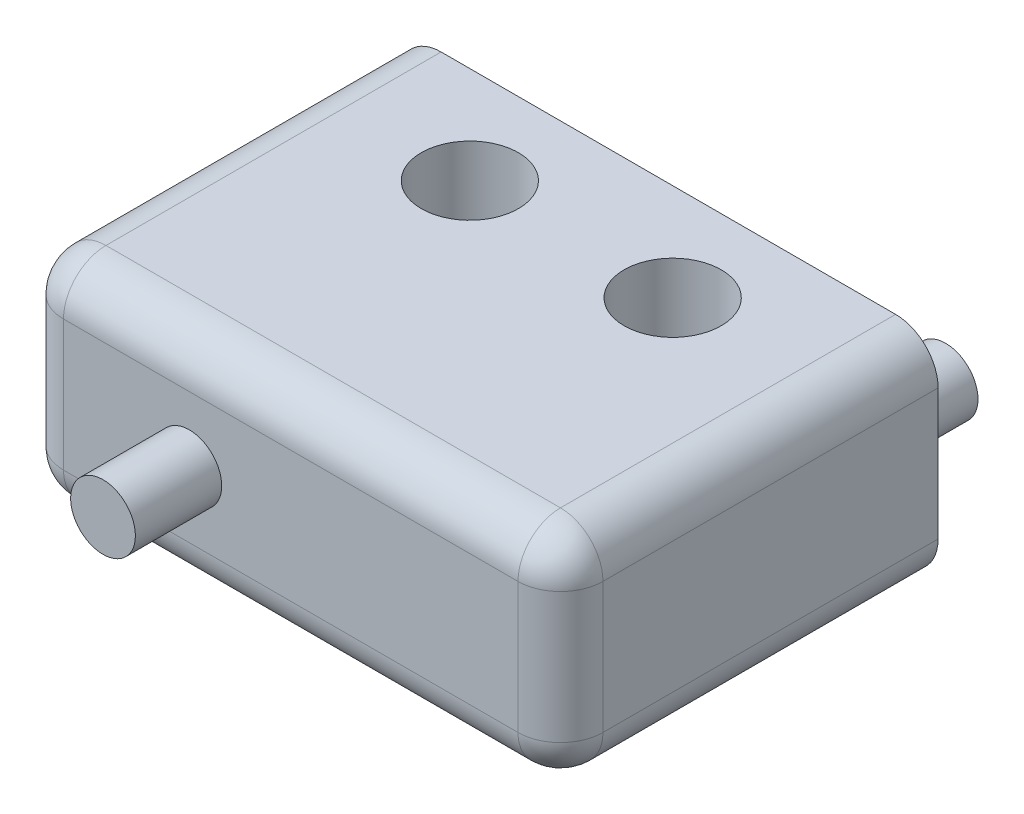
ISO-10303-21;
HEADER;
FILE_DESCRIPTION(('STEP AP214'),'2;1');
FILE_NAME('part.step','',(''),(''),'','','');
FILE_SCHEMA(('AUTOMOTIVE_DESIGN { 1 0 10303 214 1 1 1 1 }'));
ENDSEC;
DATA;
#1=APPLICATION_CONTEXT('core data for automotive mechanical design processes');
#2=APPLICATION_PROTOCOL_DEFINITION('international standard','automotive_design',2000,#1);
#3=PRODUCT_CONTEXT('',#1,'mechanical');
#4=PRODUCT('Part','Part','',(#3));
#5=PRODUCT_RELATED_PRODUCT_CATEGORY('part','',(#4));
#6=PRODUCT_DEFINITION_FORMATION('','',#4);
#7=PRODUCT_DEFINITION_CONTEXT('part definition',#1,'design');
#8=PRODUCT_DEFINITION('design','',#6,#7);
#9=PRODUCT_DEFINITION_SHAPE('','',#8);
#10=(LENGTH_UNIT() NAMED_UNIT(*) SI_UNIT(.MILLI.,.METRE.));
#11=(NAMED_UNIT(*) PLANE_ANGLE_UNIT() SI_UNIT($,.RADIAN.));
#12=(NAMED_UNIT(*) SI_UNIT($,.STERADIAN.) SOLID_ANGLE_UNIT());
#13=UNCERTAINTY_MEASURE_WITH_UNIT(LENGTH_MEASURE(1.E-05),#10,'distance_accuracy_value','');
#14=(GEOMETRIC_REPRESENTATION_CONTEXT(3) GLOBAL_UNCERTAINTY_ASSIGNED_CONTEXT((#13)) GLOBAL_UNIT_ASSIGNED_CONTEXT((#10,
#11,#12)) REPRESENTATION_CONTEXT('',''));
#15=CARTESIAN_POINT('',(0.,0.,0.));
#16=DIRECTION('',(0.,0.,1.));
#17=DIRECTION('',(1.,0.,0.));
#18=AXIS2_PLACEMENT_3D('',#15,#16,#17);
#19=CARTESIAN_POINT('',(6.35,2.54,8.89));
#20=DIRECTION('',(-1.,0.,0.));
#21=DIRECTION('',(0.,0.,1.));
#22=AXIS2_PLACEMENT_3D('',#19,#20,#21);
#23=PLANE('',#22);
#24=DIRECTION('',(0.,1.,0.));
#25=VECTOR('',#24,1.);
#26=CARTESIAN_POINT('',(6.35,2.54,0.));
#27=LINE('',#26,#25);
#28=CARTESIAN_POINT('',(6.35,-1.54,0.));
#29=VERTEX_POINT('',#28);
#30=CARTESIAN_POINT('',(6.35,1.54,0.));
#31=VERTEX_POINT('',#30);
#32=EDGE_CURVE('E212',#29,#31,#27,.T.);
#33=ORIENTED_EDGE('',*,*,#32,.T.);
#34=DIRECTION('',(0.,0.,-1.));
#35=VECTOR('',#34,1.);
#36=CARTESIAN_POINT('',(6.35,1.54,8.89));
#37=LINE('',#36,#35);
#38=CARTESIAN_POINT('',(6.35,1.54,7.89));
#39=VERTEX_POINT('',#38);
#40=EDGE_CURVE('E11',#31,#39,#37,.F.);
#41=ORIENTED_EDGE('',*,*,#40,.T.);
#42=DIRECTION('',(0.,1.,0.));
#43=VECTOR('',#42,1.);
#44=CARTESIAN_POINT('',(6.35,-2.54,7.89));
#45=LINE('',#44,#43);
#46=CARTESIAN_POINT('',(6.35,-1.54,7.89));
#47=VERTEX_POINT('',#46);
#48=EDGE_CURVE('E120',#39,#47,#45,.F.);
#49=ORIENTED_EDGE('',*,*,#48,.T.);
#50=DIRECTION('',(0.,0.,-1.));
#51=VECTOR('',#50,1.);
#52=CARTESIAN_POINT('',(6.35,-1.54,8.89));
#53=LINE('',#52,#51);
#54=EDGE_CURVE('E43',#47,#29,#53,.T.);
#55=ORIENTED_EDGE('',*,*,#54,.T.);
#56=EDGE_LOOP('',(#33,#41,#49,#55));
#57=FACE_BOUND('',#56,.T.);
#58=ADVANCED_FACE('F34',(#57),#23,.F.);
#59=CARTESIAN_POINT('',(-6.35,2.54,8.89));
#60=DIRECTION('',(0.,-1.,0.));
#61=DIRECTION('',(0.,0.,-1.));
#62=AXIS2_PLACEMENT_3D('',#59,#60,#61);
#63=PLANE('',#62);
#64=CARTESIAN_POINT('',(2.3876,2.54,2.286));
#65=DIRECTION('',(0.,1.,0.));
#66=DIRECTION('',(0.,0.,1.));
#67=AXIS2_PLACEMENT_3D('',#64,#65,#66);
#68=CIRCLE('',#67,1.143);
#69=CARTESIAN_POINT('',(2.3876,2.54,3.429));
#70=VERTEX_POINT('',#69);
#71=EDGE_CURVE('E195',#70,#70,#68,.T.);
#72=ORIENTED_EDGE('',*,*,#71,.F.);
#73=EDGE_LOOP('',(#72));
#74=FACE_BOUND('',#73,.T.);
#75=CARTESIAN_POINT('',(-2.3876,2.54,2.286));
#76=DIRECTION('',(0.,1.,0.));
#77=DIRECTION('',(0.,0.,1.));
#78=AXIS2_PLACEMENT_3D('',#75,#76,#77);
#79=CIRCLE('',#78,1.143);
#80=CARTESIAN_POINT('',(-2.3876,2.54,3.429));
#81=VERTEX_POINT('',#80);
#82=EDGE_CURVE('E187',#81,#81,#79,.T.);
#83=ORIENTED_EDGE('',*,*,#82,.F.);
#84=EDGE_LOOP('',(#83));
#85=FACE_BOUND('',#84,.T.);
#86=DIRECTION('',(-1.,0.,0.));
#87=VECTOR('',#86,1.);
#88=CARTESIAN_POINT('',(-6.35,2.54,0.));
#89=LINE('',#88,#87);
#90=CARTESIAN_POINT('',(5.35,2.54,0.));
#91=VERTEX_POINT('',#90);
#92=CARTESIAN_POINT('',(-5.35,2.54,0.));
#93=VERTEX_POINT('',#92);
#94=EDGE_CURVE('E215',#91,#93,#89,.T.);
#95=ORIENTED_EDGE('',*,*,#94,.T.);
#96=DIRECTION('',(0.,0.,-1.));
#97=VECTOR('',#96,1.);
#98=CARTESIAN_POINT('',(-5.35,2.54,8.89));
#99=LINE('',#98,#97);
#100=CARTESIAN_POINT('',(-5.35,2.54,7.89));
#101=VERTEX_POINT('',#100);
#102=EDGE_CURVE('E173',#93,#101,#99,.F.);
#103=ORIENTED_EDGE('',*,*,#102,.T.);
#104=DIRECTION('',(-1.,0.,0.));
#105=VECTOR('',#104,1.);
#106=CARTESIAN_POINT('',(6.35,2.54,7.89));
#107=LINE('',#106,#105);
#108=CARTESIAN_POINT('',(5.35,2.54,7.89));
#109=VERTEX_POINT('',#108);
#110=EDGE_CURVE('E241',#101,#109,#107,.F.);
#111=ORIENTED_EDGE('',*,*,#110,.T.);
#112=DIRECTION('',(0.,0.,-1.));
#113=VECTOR('',#112,1.);
#114=CARTESIAN_POINT('',(5.35,2.54,8.89));
#115=LINE('',#114,#113);
#116=EDGE_CURVE('E58',#109,#91,#115,.T.);
#117=ORIENTED_EDGE('',*,*,#116,.T.);
#118=EDGE_LOOP('',(#95,#103,#111,#117));
#119=FACE_BOUND('',#118,.T.);
#120=ADVANCED_FACE('F287',(#74,#85,#119),#63,.F.);
#121=CARTESIAN_POINT('',(-6.35,2.54,8.89));
#122=DIRECTION('',(1.,0.,0.));
#123=DIRECTION('',(0.,0.,-1.));
#124=AXIS2_PLACEMENT_3D('',#121,#122,#123);
#125=PLANE('',#124);
#126=DIRECTION('',(0.,-1.,0.));
#127=VECTOR('',#126,1.);
#128=CARTESIAN_POINT('',(-6.35,2.54,0.));
#129=LINE('',#128,#127);
#130=CARTESIAN_POINT('',(-6.35,1.54,0.));
#131=VERTEX_POINT('',#130);
#132=CARTESIAN_POINT('',(-6.35,-1.54,0.));
#133=VERTEX_POINT('',#132);
#134=EDGE_CURVE('E217',#131,#133,#129,.T.);
#135=ORIENTED_EDGE('',*,*,#134,.T.);
#136=DIRECTION('',(0.,0.,-1.));
#137=VECTOR('',#136,1.);
#138=CARTESIAN_POINT('',(-6.35,-1.54,8.89));
#139=LINE('',#138,#137);
#140=CARTESIAN_POINT('',(-6.35,-1.54,7.89));
#141=VERTEX_POINT('',#140);
#142=EDGE_CURVE('E170',#133,#141,#139,.F.);
#143=ORIENTED_EDGE('',*,*,#142,.T.);
#144=DIRECTION('',(0.,-1.,0.));
#145=VECTOR('',#144,1.);
#146=CARTESIAN_POINT('',(-6.35,2.54,7.89));
#147=LINE('',#146,#145);
#148=CARTESIAN_POINT('',(-6.35,1.54,7.89));
#149=VERTEX_POINT('',#148);
#150=EDGE_CURVE('E234',#141,#149,#147,.F.);
#151=ORIENTED_EDGE('',*,*,#150,.T.);
#152=DIRECTION('',(0.,0.,-1.));
#153=VECTOR('',#152,1.);
#154=CARTESIAN_POINT('',(-6.35,1.54,8.89));
#155=LINE('',#154,#153);
#156=EDGE_CURVE('E168',#149,#131,#155,.T.);
#157=ORIENTED_EDGE('',*,*,#156,.T.);
#158=EDGE_LOOP('',(#135,#143,#151,#157));
#159=FACE_BOUND('',#158,.T.);
#160=ADVANCED_FACE('F281',(#159),#125,.F.);
#161=CARTESIAN_POINT('',(-6.35,-2.54,8.89));
#162=DIRECTION('',(0.,1.,0.));
#163=DIRECTION('',(0.,0.,1.));
#164=AXIS2_PLACEMENT_3D('',#161,#162,#163);
#165=PLANE('',#164);
#166=CARTESIAN_POINT('',(2.3876,-2.54,2.286));
#167=DIRECTION('',(0.,1.,0.));
#168=DIRECTION('',(0.,0.,1.));
#169=AXIS2_PLACEMENT_3D('',#166,#167,#168);
#170=CIRCLE('',#169,1.143);
#171=CARTESIAN_POINT('',(2.3876,-2.54,3.429));
#172=VERTEX_POINT('',#171);
#173=EDGE_CURVE('E38',#172,#172,#170,.T.);
#174=ORIENTED_EDGE('',*,*,#173,.T.);
#175=EDGE_LOOP('',(#174));
#176=FACE_BOUND('',#175,.T.);
#177=CARTESIAN_POINT('',(-2.3876,-2.54,2.286));
#178=DIRECTION('',(0.,1.,0.));
#179=DIRECTION('',(0.,0.,1.));
#180=AXIS2_PLACEMENT_3D('',#177,#178,#179);
#181=CIRCLE('',#180,1.143);
#182=CARTESIAN_POINT('',(-2.3876,-2.54,3.429));
#183=VERTEX_POINT('',#182);
#184=EDGE_CURVE('E185',#183,#183,#181,.T.);
#185=ORIENTED_EDGE('',*,*,#184,.T.);
#186=EDGE_LOOP('',(#185));
#187=FACE_BOUND('',#186,.T.);
#188=DIRECTION('',(1.,0.,0.));
#189=VECTOR('',#188,1.);
#190=CARTESIAN_POINT('',(-6.35,-2.54,7.89));
#191=LINE('',#190,#189);
#192=CARTESIAN_POINT('',(5.35,-2.54,7.89));
#193=VERTEX_POINT('',#192);
#194=CARTESIAN_POINT('',(-5.35,-2.54,7.89));
#195=VERTEX_POINT('',#194);
#196=EDGE_CURVE('E237',#193,#195,#191,.F.);
#197=ORIENTED_EDGE('',*,*,#196,.T.);
#198=DIRECTION('',(0.,0.,-1.));
#199=VECTOR('',#198,1.);
#200=CARTESIAN_POINT('',(-5.35,-2.54,8.89));
#201=LINE('',#200,#199);
#202=CARTESIAN_POINT('',(-5.35,-2.54,0.));
#203=VERTEX_POINT('',#202);
#204=EDGE_CURVE('E159',#195,#203,#201,.T.);
#205=ORIENTED_EDGE('',*,*,#204,.T.);
#206=DIRECTION('',(1.,0.,0.));
#207=VECTOR('',#206,1.);
#208=CARTESIAN_POINT('',(-6.35,-2.54,0.));
#209=LINE('',#208,#207);
#210=CARTESIAN_POINT('',(5.35,-2.54,0.));
#211=VERTEX_POINT('',#210);
#212=EDGE_CURVE('E220',#203,#211,#209,.T.);
#213=ORIENTED_EDGE('',*,*,#212,.T.);
#214=DIRECTION('',(0.,0.,-1.));
#215=VECTOR('',#214,1.);
#216=CARTESIAN_POINT('',(5.35,-2.54,8.89));
#217=LINE('',#216,#215);
#218=EDGE_CURVE('E124',#211,#193,#217,.F.);
#219=ORIENTED_EDGE('',*,*,#218,.T.);
#220=EDGE_LOOP('',(#197,#205,#213,#219));
#221=FACE_BOUND('',#220,.T.);
#222=ADVANCED_FACE('F267',(#176,#187,#221),#165,.F.);
#223=CARTESIAN_POINT('',(0.,0.,8.89));
#224=DIRECTION('',(0.,0.,1.));
#225=DIRECTION('',(1.,0.,0.));
#226=AXIS2_PLACEMENT_3D('',#223,#224,#225);
#227=PLANE('',#226);
#228=DIRECTION('',(-1.,0.,0.));
#229=VECTOR('',#228,1.);
#230=CARTESIAN_POINT('',(-6.35,1.54,8.89));
#231=LINE('',#230,#229);
#232=CARTESIAN_POINT('',(5.35,1.54,8.89));
#233=VERTEX_POINT('',#232);
#234=CARTESIAN_POINT('',(-5.35,1.54,8.89));
#235=VERTEX_POINT('',#234);
#236=EDGE_CURVE('E134',#233,#235,#231,.T.);
#237=ORIENTED_EDGE('',*,*,#236,.T.);
#238=DIRECTION('',(0.,-1.,0.));
#239=VECTOR('',#238,1.);
#240=CARTESIAN_POINT('',(-5.35,-2.54,8.89));
#241=LINE('',#240,#239);
#242=CARTESIAN_POINT('',(-5.35,-1.54,8.89));
#243=VERTEX_POINT('',#242);
#244=EDGE_CURVE('E232',#235,#243,#241,.T.);
#245=ORIENTED_EDGE('',*,*,#244,.T.);
#246=DIRECTION('',(1.,0.,0.));
#247=VECTOR('',#246,1.);
#248=CARTESIAN_POINT('',(6.35,-1.54,8.89));
#249=LINE('',#248,#247);
#250=CARTESIAN_POINT('',(5.35,-1.54,8.89));
#251=VERTEX_POINT('',#250);
#252=EDGE_CURVE('E137',#243,#251,#249,.T.);
#253=ORIENTED_EDGE('',*,*,#252,.T.);
#254=DIRECTION('',(0.,1.,0.));
#255=VECTOR('',#254,1.);
#256=CARTESIAN_POINT('',(5.35,2.54,8.89));
#257=LINE('',#256,#255);
#258=EDGE_CURVE('E118',#251,#233,#257,.T.);
#259=ORIENTED_EDGE('',*,*,#258,.T.);
#260=EDGE_LOOP('',(#237,#245,#253,#259));
#261=FACE_BOUND('',#260,.T.);
#262=CARTESIAN_POINT('',(-2.3876,0.,8.89));
#263=DIRECTION('',(0.,0.,1.));
#264=DIRECTION('',(1.,0.,0.));
#265=AXIS2_PLACEMENT_3D('',#262,#263,#264);
#266=CIRCLE('',#265,0.762);
#267=CARTESIAN_POINT('',(-1.6256,0.,8.89));
#268=VERTEX_POINT('',#267);
#269=EDGE_CURVE('E179',#268,#268,#266,.T.);
#270=ORIENTED_EDGE('',*,*,#269,.F.);
#271=EDGE_LOOP('',(#270));
#272=FACE_BOUND('',#271,.T.);
#273=ADVANCED_FACE('F131',(#261,#272),#227,.T.);
#274=CARTESIAN_POINT('',(0.,0.,0.));
#275=DIRECTION('',(0.,0.,1.));
#276=DIRECTION('',(1.,0.,0.));
#277=AXIS2_PLACEMENT_3D('',#274,#275,#276);
#278=PLANE('',#277);
#279=CARTESIAN_POINT('',(-4.7498,0.,0.));
#280=DIRECTION('',(0.,0.,1.));
#281=DIRECTION('',(1.,0.,0.));
#282=AXIS2_PLACEMENT_3D('',#279,#280,#281);
#283=CIRCLE('',#282,0.761999999999999);
#284=CARTESIAN_POINT('',(-3.9878,0.,0.));
#285=VERTEX_POINT('',#284);
#286=EDGE_CURVE('E146',#285,#285,#283,.F.);
#287=ORIENTED_EDGE('',*,*,#286,.F.);
#288=EDGE_LOOP('',(#287));
#289=FACE_BOUND('',#288,.T.);
#290=CARTESIAN_POINT('',(0.,0.,0.));
#291=DIRECTION('',(0.,0.,1.));
#292=DIRECTION('',(1.,0.,0.));
#293=AXIS2_PLACEMENT_3D('',#290,#291,#292);
#294=CIRCLE('',#293,0.762);
#295=CARTESIAN_POINT('',(0.762000000000002,0.,0.));
#296=VERTEX_POINT('',#295);
#297=EDGE_CURVE('E226',#296,#296,#294,.F.);
#298=ORIENTED_EDGE('',*,*,#297,.F.);
#299=EDGE_LOOP('',(#298));
#300=FACE_BOUND('',#299,.T.);
#301=CARTESIAN_POINT('',(4.7498,0.,0.));
#302=DIRECTION('',(0.,0.,1.));
#303=DIRECTION('',(1.,0.,0.));
#304=AXIS2_PLACEMENT_3D('',#301,#302,#303);
#305=CIRCLE('',#304,0.762);
#306=CARTESIAN_POINT('',(5.5118,0.,0.));
#307=VERTEX_POINT('',#306);
#308=EDGE_CURVE('E223',#307,#307,#305,.F.);
#309=ORIENTED_EDGE('',*,*,#308,.F.);
#310=EDGE_LOOP('',(#309));
#311=FACE_BOUND('',#310,.T.);
#312=ORIENTED_EDGE('',*,*,#212,.F.);
#313=CARTESIAN_POINT('',(-5.35,-1.54,0.));
#314=DIRECTION('',(0.,0.,1.));
#315=DIRECTION('',(1.,0.,0.));
#316=AXIS2_PLACEMENT_3D('',#313,#314,#315);
#317=CIRCLE('',#316,1.);
#318=EDGE_CURVE('E166',#203,#133,#317,.F.);
#319=ORIENTED_EDGE('',*,*,#318,.T.);
#320=ORIENTED_EDGE('',*,*,#134,.F.);
#321=CARTESIAN_POINT('',(-5.35,1.54,0.));
#322=DIRECTION('',(0.,0.,1.));
#323=DIRECTION('',(1.,0.,0.));
#324=AXIS2_PLACEMENT_3D('',#321,#322,#323);
#325=CIRCLE('',#324,1.);
#326=EDGE_CURVE('E51',#131,#93,#325,.F.);
#327=ORIENTED_EDGE('',*,*,#326,.T.);
#328=ORIENTED_EDGE('',*,*,#94,.F.);
#329=CARTESIAN_POINT('',(5.35,1.54,0.));
#330=DIRECTION('',(0.,0.,1.));
#331=DIRECTION('',(1.,0.,0.));
#332=AXIS2_PLACEMENT_3D('',#329,#330,#331);
#333=CIRCLE('',#332,1.);
#334=EDGE_CURVE('E163',#91,#31,#333,.F.);
#335=ORIENTED_EDGE('',*,*,#334,.T.);
#336=ORIENTED_EDGE('',*,*,#32,.F.);
#337=CARTESIAN_POINT('',(5.35,-1.54,0.));
#338=DIRECTION('',(0.,0.,1.));
#339=DIRECTION('',(1.,0.,0.));
#340=AXIS2_PLACEMENT_3D('',#337,#338,#339);
#341=CIRCLE('',#340,1.);
#342=EDGE_CURVE('E161',#29,#211,#341,.F.);
#343=ORIENTED_EDGE('',*,*,#342,.T.);
#344=EDGE_LOOP('',(#312,#319,#320,#327,#328,#335,#336,#343));
#345=FACE_BOUND('',#344,.T.);
#346=ADVANCED_FACE('F264',(#289,#300,#311,#345),#278,.F.);
#347=CARTESIAN_POINT('',(4.7498,0.,-1.778));
#348=DIRECTION('',(0.,0.,1.));
#349=DIRECTION('',(1.,0.,0.));
#350=AXIS2_PLACEMENT_3D('',#347,#348,#349);
#351=CYLINDRICAL_SURFACE('',#350,0.762);
#352=CARTESIAN_POINT('',(4.7498,0.,-1.778));
#353=DIRECTION('',(0.,0.,-1.));
#354=DIRECTION('',(-1.,0.,0.));
#355=AXIS2_PLACEMENT_3D('',#352,#353,#354);
#356=CIRCLE('',#355,0.762);
#357=CARTESIAN_POINT('',(3.9878,0.,-1.778));
#358=VERTEX_POINT('',#357);
#359=EDGE_CURVE('E209',#358,#358,#356,.T.);
#360=ORIENTED_EDGE('',*,*,#359,.F.);
#361=EDGE_LOOP('',(#360));
#362=FACE_BOUND('',#361,.T.);
#363=ORIENTED_EDGE('',*,*,#308,.T.);
#364=EDGE_LOOP('',(#363));
#365=FACE_BOUND('',#364,.T.);
#366=ADVANCED_FACE('F440',(#362,#365),#351,.T.);
#367=CARTESIAN_POINT('',(4.7498,0.,-1.778));
#368=DIRECTION('',(0.,0.,-1.));
#369=DIRECTION('',(-1.,0.,0.));
#370=AXIS2_PLACEMENT_3D('',#367,#368,#369);
#371=PLANE('',#370);
#372=ORIENTED_EDGE('',*,*,#359,.T.);
#373=EDGE_LOOP('',(#372));
#374=FACE_BOUND('',#373,.T.);
#375=ADVANCED_FACE('F436',(#374),#371,.T.);
#376=CARTESIAN_POINT('',(0.,0.,-1.778));
#377=DIRECTION('',(0.,0.,1.));
#378=DIRECTION('',(1.,0.,0.));
#379=AXIS2_PLACEMENT_3D('',#376,#377,#378);
#380=CYLINDRICAL_SURFACE('',#379,0.762);
#381=CARTESIAN_POINT('',(0.,0.,-1.778));
#382=DIRECTION('',(0.,0.,-1.));
#383=DIRECTION('',(-1.,0.,0.));
#384=AXIS2_PLACEMENT_3D('',#381,#382,#383);
#385=CIRCLE('',#384,0.762);
#386=CARTESIAN_POINT('',(-0.761999999999998,0.,-1.778));
#387=VERTEX_POINT('',#386);
#388=EDGE_CURVE('E206',#387,#387,#385,.T.);
#389=ORIENTED_EDGE('',*,*,#388,.F.);
#390=EDGE_LOOP('',(#389));
#391=FACE_BOUND('',#390,.T.);
#392=ORIENTED_EDGE('',*,*,#297,.T.);
#393=EDGE_LOOP('',(#392));
#394=FACE_BOUND('',#393,.T.);
#395=ADVANCED_FACE('F432',(#391,#394),#380,.T.);
#396=CARTESIAN_POINT('',(0.,0.,-1.778));
#397=DIRECTION('',(0.,0.,-1.));
#398=DIRECTION('',(-1.,0.,0.));
#399=AXIS2_PLACEMENT_3D('',#396,#397,#398);
#400=PLANE('',#399);
#401=ORIENTED_EDGE('',*,*,#388,.T.);
#402=EDGE_LOOP('',(#401));
#403=FACE_BOUND('',#402,.T.);
#404=ADVANCED_FACE('F428',(#403),#400,.T.);
#405=CARTESIAN_POINT('',(-4.7498,0.,-1.778));
#406=DIRECTION('',(0.,0.,1.));
#407=DIRECTION('',(1.,0.,0.));
#408=AXIS2_PLACEMENT_3D('',#405,#406,#407);
#409=CYLINDRICAL_SURFACE('',#408,0.761999999999999);
#410=CARTESIAN_POINT('',(-4.7498,0.,-1.778));
#411=DIRECTION('',(0.,0.,-1.));
#412=DIRECTION('',(-1.,0.,0.));
#413=AXIS2_PLACEMENT_3D('',#410,#411,#412);
#414=CIRCLE('',#413,0.761999999999999);
#415=CARTESIAN_POINT('',(-5.5118,0.,-1.778));
#416=VERTEX_POINT('',#415);
#417=EDGE_CURVE('E201',#416,#416,#414,.T.);
#418=ORIENTED_EDGE('',*,*,#417,.F.);
#419=EDGE_LOOP('',(#418));
#420=FACE_BOUND('',#419,.T.);
#421=ORIENTED_EDGE('',*,*,#286,.T.);
#422=EDGE_LOOP('',(#421));
#423=FACE_BOUND('',#422,.T.);
#424=ADVANCED_FACE('F424',(#420,#423),#409,.T.);
#425=CARTESIAN_POINT('',(-4.7498,0.,-1.778));
#426=DIRECTION('',(0.,0.,-1.));
#427=DIRECTION('',(-1.,0.,0.));
#428=AXIS2_PLACEMENT_3D('',#425,#426,#427);
#429=PLANE('',#428);
#430=ORIENTED_EDGE('',*,*,#417,.T.);
#431=EDGE_LOOP('',(#430));
#432=FACE_BOUND('',#431,.T.);
#433=ADVANCED_FACE('F420',(#432),#429,.T.);
#434=CARTESIAN_POINT('',(-2.3876,0.,10.922));
#435=DIRECTION('',(0.,0.,-1.));
#436=DIRECTION('',(-1.,0.,0.));
#437=AXIS2_PLACEMENT_3D('',#434,#435,#436);
#438=CYLINDRICAL_SURFACE('',#437,0.762);
#439=CARTESIAN_POINT('',(-2.3876,0.,10.922));
#440=DIRECTION('',(0.,0.,1.));
#441=DIRECTION('',(1.,0.,0.));
#442=AXIS2_PLACEMENT_3D('',#439,#440,#441);
#443=CIRCLE('',#442,0.762);
#444=CARTESIAN_POINT('',(-1.6256,0.,10.922));
#445=VERTEX_POINT('',#444);
#446=EDGE_CURVE('E198',#445,#445,#443,.T.);
#447=ORIENTED_EDGE('',*,*,#446,.F.);
#448=EDGE_LOOP('',(#447));
#449=FACE_BOUND('',#448,.T.);
#450=ORIENTED_EDGE('',*,*,#269,.T.);
#451=EDGE_LOOP('',(#450));
#452=FACE_BOUND('',#451,.T.);
#453=ADVANCED_FACE('F416',(#449,#452),#438,.T.);
#454=CARTESIAN_POINT('',(-2.3876,0.,10.922));
#455=DIRECTION('',(0.,0.,1.));
#456=DIRECTION('',(1.,0.,0.));
#457=AXIS2_PLACEMENT_3D('',#454,#455,#456);
#458=PLANE('',#457);
#459=ORIENTED_EDGE('',*,*,#446,.T.);
#460=EDGE_LOOP('',(#459));
#461=FACE_BOUND('',#460,.T.);
#462=ADVANCED_FACE('F318',(#461),#458,.T.);
#463=CARTESIAN_POINT('',(5.35,0.,7.89));
#464=DIRECTION('',(0.,-1.,0.));
#465=DIRECTION('',(0.,0.,-1.));
#466=AXIS2_PLACEMENT_3D('',#463,#464,#465);
#467=CYLINDRICAL_SURFACE('',#466,1.);
#468=ORIENTED_EDGE('',*,*,#48,.F.);
#469=CARTESIAN_POINT('',(5.35,1.54,7.89));
#470=DIRECTION('',(0.,-1.,0.));
#471=DIRECTION('',(0.,0.,-1.));
#472=AXIS2_PLACEMENT_3D('',#469,#470,#471);
#473=CIRCLE('',#472,1.);
#474=EDGE_CURVE('E115',#39,#233,#473,.T.);
#475=ORIENTED_EDGE('',*,*,#474,.T.);
#476=ORIENTED_EDGE('',*,*,#258,.F.);
#477=CARTESIAN_POINT('',(5.35,-1.54,7.89));
#478=DIRECTION('',(0.,-1.,0.));
#479=DIRECTION('',(0.,0.,-1.));
#480=AXIS2_PLACEMENT_3D('',#477,#478,#479);
#481=CIRCLE('',#480,1.);
#482=EDGE_CURVE('E125',#251,#47,#481,.F.);
#483=ORIENTED_EDGE('',*,*,#482,.T.);
#484=EDGE_LOOP('',(#468,#475,#476,#483));
#485=FACE_BOUND('',#484,.T.);
#486=ADVANCED_FACE('F117',(#485),#467,.T.);
#487=CARTESIAN_POINT('',(0.,1.54,7.89));
#488=DIRECTION('',(1.,0.,0.));
#489=DIRECTION('',(0.,0.,-1.));
#490=AXIS2_PLACEMENT_3D('',#487,#488,#489);
#491=CYLINDRICAL_SURFACE('',#490,1.);
#492=ORIENTED_EDGE('',*,*,#110,.F.);
#493=CARTESIAN_POINT('',(-5.35,1.54,7.89));
#494=DIRECTION('',(1.,0.,0.));
#495=DIRECTION('',(0.,0.,-1.));
#496=AXIS2_PLACEMENT_3D('',#493,#494,#495);
#497=CIRCLE('',#496,1.);
#498=EDGE_CURVE('E145',#101,#235,#497,.T.);
#499=ORIENTED_EDGE('',*,*,#498,.T.);
#500=ORIENTED_EDGE('',*,*,#236,.F.);
#501=CARTESIAN_POINT('',(5.35,1.54,7.89));
#502=DIRECTION('',(1.,0.,0.));
#503=DIRECTION('',(0.,0.,-1.));
#504=AXIS2_PLACEMENT_3D('',#501,#502,#503);
#505=CIRCLE('',#504,1.);
#506=EDGE_CURVE('E143',#233,#109,#505,.F.);
#507=ORIENTED_EDGE('',*,*,#506,.T.);
#508=EDGE_LOOP('',(#492,#499,#500,#507));
#509=FACE_BOUND('',#508,.T.);
#510=ADVANCED_FACE('F142',(#509),#491,.T.);
#511=CARTESIAN_POINT('',(0.,-1.54,7.89));
#512=DIRECTION('',(-1.,0.,0.));
#513=DIRECTION('',(0.,0.,1.));
#514=AXIS2_PLACEMENT_3D('',#511,#512,#513);
#515=CYLINDRICAL_SURFACE('',#514,1.);
#516=ORIENTED_EDGE('',*,*,#252,.F.);
#517=CARTESIAN_POINT('',(-5.35,-1.54,7.89));
#518=DIRECTION('',(-1.,0.,0.));
#519=DIRECTION('',(0.,0.,1.));
#520=AXIS2_PLACEMENT_3D('',#517,#518,#519);
#521=CIRCLE('',#520,1.);
#522=EDGE_CURVE('E150',#243,#195,#521,.F.);
#523=ORIENTED_EDGE('',*,*,#522,.T.);
#524=ORIENTED_EDGE('',*,*,#196,.F.);
#525=CARTESIAN_POINT('',(5.35,-1.54,7.89));
#526=DIRECTION('',(-1.,0.,0.));
#527=DIRECTION('',(0.,0.,1.));
#528=AXIS2_PLACEMENT_3D('',#525,#526,#527);
#529=CIRCLE('',#528,1.);
#530=EDGE_CURVE('E153',#193,#251,#529,.T.);
#531=ORIENTED_EDGE('',*,*,#530,.T.);
#532=EDGE_LOOP('',(#516,#523,#524,#531));
#533=FACE_BOUND('',#532,.T.);
#534=ADVANCED_FACE('F252',(#533),#515,.T.);
#535=CARTESIAN_POINT('',(-5.35,0.,7.89));
#536=DIRECTION('',(0.,1.,0.));
#537=DIRECTION('',(0.,0.,1.));
#538=AXIS2_PLACEMENT_3D('',#535,#536,#537);
#539=CYLINDRICAL_SURFACE('',#538,1.);
#540=ORIENTED_EDGE('',*,*,#150,.F.);
#541=CARTESIAN_POINT('',(-5.35,-1.54,7.89));
#542=DIRECTION('',(0.,1.,0.));
#543=DIRECTION('',(0.,0.,1.));
#544=AXIS2_PLACEMENT_3D('',#541,#542,#543);
#545=CIRCLE('',#544,1.);
#546=EDGE_CURVE('E246',#141,#243,#545,.T.);
#547=ORIENTED_EDGE('',*,*,#546,.T.);
#548=ORIENTED_EDGE('',*,*,#244,.F.);
#549=CARTESIAN_POINT('',(-5.35,1.54,7.89));
#550=DIRECTION('',(0.,1.,0.));
#551=DIRECTION('',(0.,0.,1.));
#552=AXIS2_PLACEMENT_3D('',#549,#550,#551);
#553=CIRCLE('',#552,1.);
#554=EDGE_CURVE('E243',#235,#149,#553,.F.);
#555=ORIENTED_EDGE('',*,*,#554,.T.);
#556=EDGE_LOOP('',(#540,#547,#548,#555));
#557=FACE_BOUND('',#556,.T.);
#558=ADVANCED_FACE('F278',(#557),#539,.T.);
#559=CARTESIAN_POINT('',(-5.35,-1.54,8.89));
#560=DIRECTION('',(0.,0.,-1.));
#561=DIRECTION('',(-1.,0.,0.));
#562=AXIS2_PLACEMENT_3D('',#559,#560,#561);
#563=CYLINDRICAL_SURFACE('',#562,1.);
#564=ORIENTED_EDGE('',*,*,#318,.F.);
#565=ORIENTED_EDGE('',*,*,#204,.F.);
#566=CARTESIAN_POINT('',(-5.35,-1.54,7.89));
#567=DIRECTION('',(0.,0.,1.));
#568=DIRECTION('',(1.,0.,0.));
#569=AXIS2_PLACEMENT_3D('',#566,#567,#568);
#570=CIRCLE('',#569,1.);
#571=EDGE_CURVE('E176',#141,#195,#570,.T.);
#572=ORIENTED_EDGE('',*,*,#571,.F.);
#573=ORIENTED_EDGE('',*,*,#142,.F.);
#574=EDGE_LOOP('',(#564,#565,#572,#573));
#575=FACE_BOUND('',#574,.T.);
#576=ADVANCED_FACE('F271',(#575),#563,.T.);
#577=CARTESIAN_POINT('',(-5.35,-1.54,7.89));
#578=DIRECTION('',(0.,0.,1.));
#579=DIRECTION('',(1.,0.,0.));
#580=AXIS2_PLACEMENT_3D('',#577,#578,#579);
#581=SPHERICAL_SURFACE('',#580,1.);
#582=ORIENTED_EDGE('',*,*,#571,.T.);
#583=ORIENTED_EDGE('',*,*,#522,.F.);
#584=ORIENTED_EDGE('',*,*,#546,.F.);
#585=EDGE_LOOP('',(#582,#583,#584));
#586=FACE_BOUND('',#585,.T.);
#587=ADVANCED_FACE('F275',(#586),#581,.T.);
#588=CARTESIAN_POINT('',(-5.35,1.54,8.89));
#589=DIRECTION('',(0.,0.,-1.));
#590=DIRECTION('',(-1.,0.,0.));
#591=AXIS2_PLACEMENT_3D('',#588,#589,#590);
#592=CYLINDRICAL_SURFACE('',#591,1.);
#593=ORIENTED_EDGE('',*,*,#326,.F.);
#594=ORIENTED_EDGE('',*,*,#156,.F.);
#595=CARTESIAN_POINT('',(-5.35,1.54,7.89));
#596=DIRECTION('',(0.,0.,1.));
#597=DIRECTION('',(1.,0.,0.));
#598=AXIS2_PLACEMENT_3D('',#595,#596,#597);
#599=CIRCLE('',#598,1.);
#600=EDGE_CURVE('E180',#101,#149,#599,.T.);
#601=ORIENTED_EDGE('',*,*,#600,.F.);
#602=ORIENTED_EDGE('',*,*,#102,.F.);
#603=EDGE_LOOP('',(#593,#594,#601,#602));
#604=FACE_BOUND('',#603,.T.);
#605=ADVANCED_FACE('F285',(#604),#592,.T.);
#606=CARTESIAN_POINT('',(-5.35,1.54,7.89));
#607=DIRECTION('',(0.,0.,1.));
#608=DIRECTION('',(1.,0.,0.));
#609=AXIS2_PLACEMENT_3D('',#606,#607,#608);
#610=SPHERICAL_SURFACE('',#609,1.);
#611=ORIENTED_EDGE('',*,*,#554,.F.);
#612=ORIENTED_EDGE('',*,*,#498,.F.);
#613=ORIENTED_EDGE('',*,*,#600,.T.);
#614=EDGE_LOOP('',(#611,#612,#613));
#615=FACE_BOUND('',#614,.T.);
#616=ADVANCED_FACE('F289',(#615),#610,.T.);
#617=CARTESIAN_POINT('',(5.35,1.54,8.89));
#618=DIRECTION('',(0.,0.,-1.));
#619=DIRECTION('',(-1.,0.,0.));
#620=AXIS2_PLACEMENT_3D('',#617,#618,#619);
#621=CYLINDRICAL_SURFACE('',#620,1.);
#622=ORIENTED_EDGE('',*,*,#334,.F.);
#623=ORIENTED_EDGE('',*,*,#116,.F.);
#624=CARTESIAN_POINT('',(5.35,1.54,7.89));
#625=DIRECTION('',(0.,0.,1.));
#626=DIRECTION('',(1.,0.,0.));
#627=AXIS2_PLACEMENT_3D('',#624,#625,#626);
#628=CIRCLE('',#627,1.);
#629=EDGE_CURVE('E149',#39,#109,#628,.T.);
#630=ORIENTED_EDGE('',*,*,#629,.F.);
#631=ORIENTED_EDGE('',*,*,#40,.F.);
#632=EDGE_LOOP('',(#622,#623,#630,#631));
#633=FACE_BOUND('',#632,.T.);
#634=ADVANCED_FACE('F291',(#633),#621,.T.);
#635=CARTESIAN_POINT('',(5.35,1.54,7.89));
#636=DIRECTION('',(0.,0.,1.));
#637=DIRECTION('',(1.,0.,0.));
#638=AXIS2_PLACEMENT_3D('',#635,#636,#637);
#639=SPHERICAL_SURFACE('',#638,1.);
#640=ORIENTED_EDGE('',*,*,#506,.F.);
#641=ORIENTED_EDGE('',*,*,#474,.F.);
#642=ORIENTED_EDGE('',*,*,#629,.T.);
#643=EDGE_LOOP('',(#640,#641,#642));
#644=FACE_BOUND('',#643,.T.);
#645=ADVANCED_FACE('F148',(#644),#639,.T.);
#646=CARTESIAN_POINT('',(5.35,-1.54,8.89));
#647=DIRECTION('',(0.,0.,-1.));
#648=DIRECTION('',(-1.,0.,0.));
#649=AXIS2_PLACEMENT_3D('',#646,#647,#648);
#650=CYLINDRICAL_SURFACE('',#649,1.);
#651=ORIENTED_EDGE('',*,*,#342,.F.);
#652=ORIENTED_EDGE('',*,*,#54,.F.);
#653=CARTESIAN_POINT('',(5.35,-1.54,7.89));
#654=DIRECTION('',(0.,0.,1.));
#655=DIRECTION('',(1.,0.,0.));
#656=AXIS2_PLACEMENT_3D('',#653,#654,#655);
#657=CIRCLE('',#656,1.);
#658=EDGE_CURVE('E183',#193,#47,#657,.T.);
#659=ORIENTED_EDGE('',*,*,#658,.F.);
#660=ORIENTED_EDGE('',*,*,#218,.F.);
#661=EDGE_LOOP('',(#651,#652,#659,#660));
#662=FACE_BOUND('',#661,.T.);
#663=ADVANCED_FACE('F36',(#662),#650,.T.);
#664=CARTESIAN_POINT('',(5.35,-1.54,7.89));
#665=DIRECTION('',(0.,0.,1.));
#666=DIRECTION('',(1.,0.,0.));
#667=AXIS2_PLACEMENT_3D('',#664,#665,#666);
#668=SPHERICAL_SURFACE('',#667,1.);
#669=ORIENTED_EDGE('',*,*,#658,.T.);
#670=ORIENTED_EDGE('',*,*,#482,.F.);
#671=ORIENTED_EDGE('',*,*,#530,.F.);
#672=EDGE_LOOP('',(#669,#670,#671));
#673=FACE_BOUND('',#672,.T.);
#674=ADVANCED_FACE('F255',(#673),#668,.T.);
#675=CARTESIAN_POINT('',(-2.3876,-3.46,2.286));
#676=DIRECTION('',(0.,1.,0.));
#677=DIRECTION('',(0.,0.,1.));
#678=AXIS2_PLACEMENT_3D('',#675,#676,#677);
#679=CYLINDRICAL_SURFACE('',#678,1.143);
#680=ORIENTED_EDGE('',*,*,#82,.T.);
#681=EDGE_LOOP('',(#680));
#682=FACE_BOUND('',#681,.T.);
#683=ORIENTED_EDGE('',*,*,#184,.F.);
#684=EDGE_LOOP('',(#683));
#685=FACE_BOUND('',#684,.T.);
#686=ADVANCED_FACE('F369',(#682,#685),#679,.F.);
#687=CARTESIAN_POINT('',(2.3876,-3.46,2.286));
#688=DIRECTION('',(0.,1.,0.));
#689=DIRECTION('',(0.,0.,1.));
#690=AXIS2_PLACEMENT_3D('',#687,#688,#689);
#691=CYLINDRICAL_SURFACE('',#690,1.143);
#692=ORIENTED_EDGE('',*,*,#71,.T.);
#693=EDGE_LOOP('',(#692));
#694=FACE_BOUND('',#693,.T.);
#695=ORIENTED_EDGE('',*,*,#173,.F.);
#696=EDGE_LOOP('',(#695));
#697=FACE_BOUND('',#696,.T.);
#698=ADVANCED_FACE('F398',(#694,#697),#691,.F.);
#699=CLOSED_SHELL('',(#58,#120,#160,#222,#273,#346,#366,#375,#395,#404,#424,#433,#453,#462,#486,
#510,#534,#558,#576,#587,#605,#616,#634,#645,#663,#674,#686,#698));
#700=MANIFOLD_SOLID_BREP('B2',#699);
#701=ADVANCED_BREP_SHAPE_REPRESENTATION('',(#18,#700),#14);
#702=SHAPE_DEFINITION_REPRESENTATION(#9,#701);
ENDSEC;
END-ISO-10303-21;
